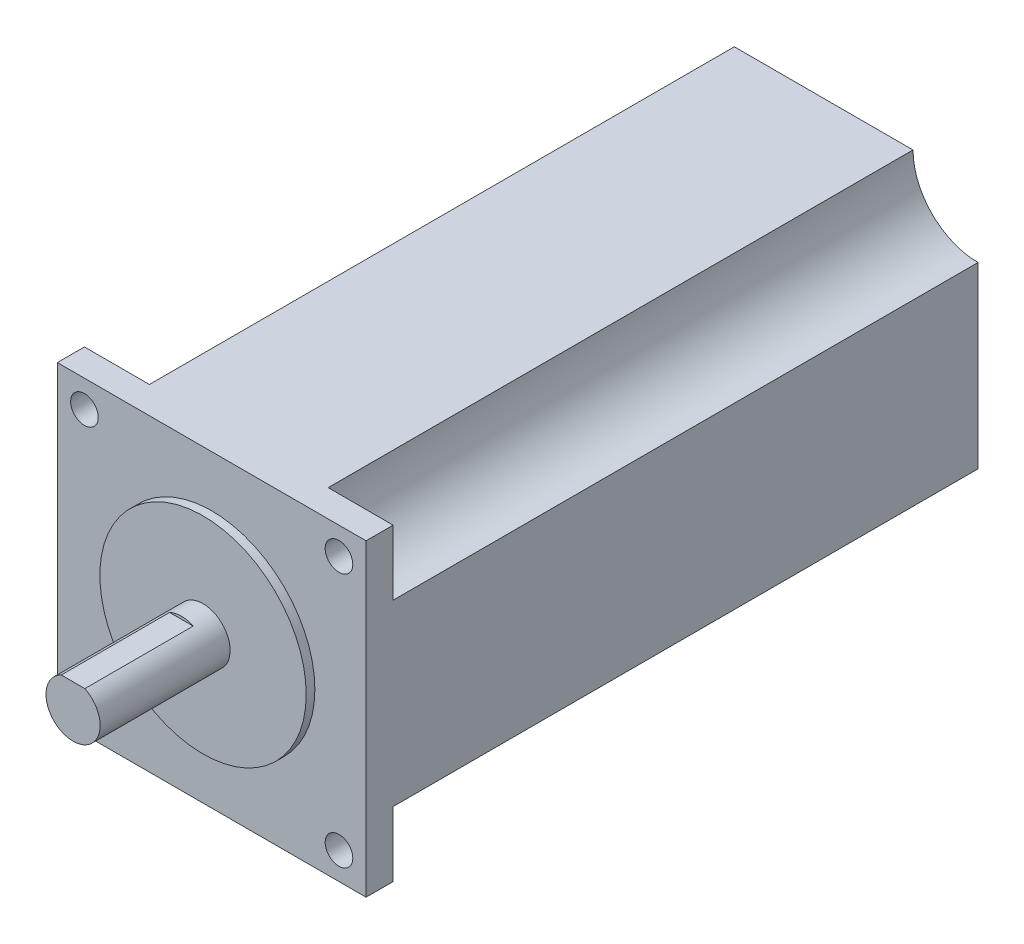
ISO-10303-21;
HEADER;
FILE_DESCRIPTION(('STEP AP214'),'2;1');
FILE_NAME('part.step','',(''),(''),'','','');
FILE_SCHEMA(('AUTOMOTIVE_DESIGN { 1 0 10303 214 1 1 1 1 }'));
ENDSEC;
DATA;
#1=APPLICATION_CONTEXT('core data for automotive mechanical design processes');
#2=APPLICATION_PROTOCOL_DEFINITION('international standard','automotive_design',2000,#1);
#3=PRODUCT_CONTEXT('',#1,'mechanical');
#4=PRODUCT('Part','Part','',(#3));
#5=PRODUCT_RELATED_PRODUCT_CATEGORY('part','',(#4));
#6=PRODUCT_DEFINITION_FORMATION('','',#4);
#7=PRODUCT_DEFINITION_CONTEXT('part definition',#1,'design');
#8=PRODUCT_DEFINITION('design','',#6,#7);
#9=PRODUCT_DEFINITION_SHAPE('','',#8);
#10=(LENGTH_UNIT() NAMED_UNIT(*) SI_UNIT(.MILLI.,.METRE.));
#11=(NAMED_UNIT(*) PLANE_ANGLE_UNIT() SI_UNIT($,.RADIAN.));
#12=(NAMED_UNIT(*) SI_UNIT($,.STERADIAN.) SOLID_ANGLE_UNIT());
#13=UNCERTAINTY_MEASURE_WITH_UNIT(LENGTH_MEASURE(1.E-05),#10,'distance_accuracy_value','');
#14=(GEOMETRIC_REPRESENTATION_CONTEXT(3) GLOBAL_UNCERTAINTY_ASSIGNED_CONTEXT((#13)) GLOBAL_UNIT_ASSIGNED_CONTEXT((#10,
#11,#12)) REPRESENTATION_CONTEXT('',''));
#15=CARTESIAN_POINT('',(0.,0.,0.));
#16=DIRECTION('',(0.,0.,1.));
#17=DIRECTION('',(1.,0.,0.));
#18=AXIS2_PLACEMENT_3D('',#15,#16,#17);
#19=CARTESIAN_POINT('',(0.,0.,0.));
#20=DIRECTION('',(0.,0.,1.));
#21=DIRECTION('',(1.,0.,0.));
#22=AXIS2_PLACEMENT_3D('',#19,#20,#21);
#23=PLANE('',#22);
#24=CARTESIAN_POINT('',(13.1457851813188,-0.458965641473671,0.));
#25=DIRECTION('',(0.,0.,1.));
#26=DIRECTION('',(1.,0.,0.));
#27=AXIS2_PLACEMENT_3D('',#24,#25,#26);
#28=CIRCLE('',#27,2.55);
#29=CARTESIAN_POINT('',(15.6957851813188,-0.458965641473671,0.));
#30=VERTEX_POINT('',#29);
#31=EDGE_CURVE('E230',#30,#30,#28,.T.);
#32=ORIENTED_EDGE('',*,*,#31,.T.);
#33=EDGE_LOOP('',(#32));
#34=FACE_BOUND('',#33,.T.);
#35=CARTESIAN_POINT('',(18.1457851813188,4.54103435852635,0.));
#36=DIRECTION('',(0.,0.,1.));
#37=DIRECTION('',(-1.,0.,0.));
#38=AXIS2_PLACEMENT_3D('',#35,#36,#37);
#39=CIRCLE('',#38,12.);
#40=CARTESIAN_POINT('',(6.14578518131879,4.54103435852635,0.));
#41=VERTEX_POINT('',#40);
#42=CARTESIAN_POINT('',(18.1457851813188,-7.45896564147366,0.));
#43=VERTEX_POINT('',#42);
#44=EDGE_CURVE('E167',#41,#43,#39,.T.);
#45=ORIENTED_EDGE('',*,*,#44,.F.);
#46=DIRECTION('',(-1.,0.,0.));
#47=VECTOR('',#46,1.);
#48=CARTESIAN_POINT('',(-38.8542148186812,4.54103435852635,0.));
#49=LINE('',#48,#47);
#50=CARTESIAN_POINT('',(18.1457851813188,4.54103435852635,0.));
#51=VERTEX_POINT('',#50);
#52=EDGE_CURVE('E249',#51,#41,#49,.T.);
#53=ORIENTED_EDGE('',*,*,#52,.F.);
#54=DIRECTION('',(0.,1.,0.));
#55=VECTOR('',#54,1.);
#56=CARTESIAN_POINT('',(18.1457851813188,4.54103435852635,0.));
#57=LINE('',#56,#55);
#58=EDGE_CURVE('E262',#43,#51,#57,.T.);
#59=ORIENTED_EDGE('',*,*,#58,.F.);
#60=EDGE_LOOP('',(#45,#53,#59));
#61=FACE_BOUND('',#60,.T.);
#62=ADVANCED_FACE('F38',(#34,#61),#23,.F.);
#63=CARTESIAN_POINT('',(-33.8542148186812,-0.458965641473678,0.));
#64=DIRECTION('',(0.,0.,1.));
#65=DIRECTION('',(1.,0.,0.));
#66=AXIS2_PLACEMENT_3D('',#63,#64,#65);
#67=CIRCLE('',#66,2.54999999999999);
#68=CARTESIAN_POINT('',(-31.3042148186812,-0.458965641473678,0.));
#69=VERTEX_POINT('',#68);
#70=EDGE_CURVE('E236',#69,#69,#67,.T.);
#71=ORIENTED_EDGE('',*,*,#70,.T.);
#72=EDGE_LOOP('',(#71));
#73=FACE_BOUND('',#72,.T.);
#74=CARTESIAN_POINT('',(-38.8542148186812,4.54103435852636,0.));
#75=DIRECTION('',(0.,0.,1.));
#76=DIRECTION('',(-1.,0.,0.));
#77=AXIS2_PLACEMENT_3D('',#74,#75,#76);
#78=CIRCLE('',#77,12.);
#79=CARTESIAN_POINT('',(-38.8542148186812,-7.45896564147367,0.));
#80=VERTEX_POINT('',#79);
#81=CARTESIAN_POINT('',(-26.8542148186812,4.54103435852635,0.));
#82=VERTEX_POINT('',#81);
#83=EDGE_CURVE('E174',#80,#82,#78,.T.);
#84=ORIENTED_EDGE('',*,*,#83,.F.);
#85=DIRECTION('',(0.,-1.,0.));
#86=VECTOR('',#85,1.);
#87=CARTESIAN_POINT('',(-38.8542148186812,4.54103435852635,0.));
#88=LINE('',#87,#86);
#89=CARTESIAN_POINT('',(-38.8542148186812,4.54103435852635,0.));
#90=VERTEX_POINT('',#89);
#91=EDGE_CURVE('E256',#90,#80,#88,.T.);
#92=ORIENTED_EDGE('',*,*,#91,.F.);
#93=EDGE_CURVE('E266',#82,#90,#49,.T.);
#94=ORIENTED_EDGE('',*,*,#93,.F.);
#95=EDGE_LOOP('',(#84,#92,#94));
#96=FACE_BOUND('',#95,.T.);
#97=ADVANCED_FACE('F291',(#73,#96),#23,.F.);
#98=CARTESIAN_POINT('',(-33.8542148186812,-47.4589656414737,0.));
#99=DIRECTION('',(0.,0.,1.));
#100=DIRECTION('',(1.,0.,0.));
#101=AXIS2_PLACEMENT_3D('',#98,#99,#100);
#102=CIRCLE('',#101,2.54999999999999);
#103=CARTESIAN_POINT('',(-31.3042148186812,-47.4589656414737,0.));
#104=VERTEX_POINT('',#103);
#105=EDGE_CURVE('E220',#104,#104,#102,.T.);
#106=ORIENTED_EDGE('',*,*,#105,.T.);
#107=EDGE_LOOP('',(#106));
#108=FACE_BOUND('',#107,.T.);
#109=CARTESIAN_POINT('',(-38.8542148186812,-52.4589656414737,0.));
#110=DIRECTION('',(0.,0.,1.));
#111=DIRECTION('',(1.,0.,0.));
#112=AXIS2_PLACEMENT_3D('',#109,#110,#111);
#113=CIRCLE('',#112,12.);
#114=CARTESIAN_POINT('',(-26.8542148186812,-52.4589656414737,0.));
#115=VERTEX_POINT('',#114);
#116=CARTESIAN_POINT('',(-38.8542148186812,-40.4589656414736,0.));
#117=VERTEX_POINT('',#116);
#118=EDGE_CURVE('E61',#115,#117,#113,.T.);
#119=ORIENTED_EDGE('',*,*,#118,.F.);
#120=DIRECTION('',(1.,0.,0.));
#121=VECTOR('',#120,1.);
#122=CARTESIAN_POINT('',(-38.8542148186812,-52.4589656414737,0.));
#123=LINE('',#122,#121);
#124=CARTESIAN_POINT('',(-38.8542148186812,-52.4589656414737,0.));
#125=VERTEX_POINT('',#124);
#126=EDGE_CURVE('E260',#125,#115,#123,.T.);
#127=ORIENTED_EDGE('',*,*,#126,.F.);
#128=EDGE_CURVE('E242',#117,#125,#88,.T.);
#129=ORIENTED_EDGE('',*,*,#128,.F.);
#130=EDGE_LOOP('',(#119,#127,#129));
#131=FACE_BOUND('',#130,.T.);
#132=ADVANCED_FACE('F288',(#108,#131),#23,.F.);
#133=CARTESIAN_POINT('',(13.1457851813188,-47.4589656414737,0.));
#134=DIRECTION('',(0.,0.,1.));
#135=DIRECTION('',(1.,0.,0.));
#136=AXIS2_PLACEMENT_3D('',#133,#134,#135);
#137=CIRCLE('',#136,2.55);
#138=CARTESIAN_POINT('',(15.6957851813188,-47.4589656414737,0.));
#139=VERTEX_POINT('',#138);
#140=EDGE_CURVE('E224',#139,#139,#137,.T.);
#141=ORIENTED_EDGE('',*,*,#140,.T.);
#142=EDGE_LOOP('',(#141));
#143=FACE_BOUND('',#142,.T.);
#144=CARTESIAN_POINT('',(18.1457851813188,-52.4589656414737,0.));
#145=DIRECTION('',(0.,0.,1.));
#146=DIRECTION('',(-1.,0.,0.));
#147=AXIS2_PLACEMENT_3D('',#144,#145,#146);
#148=CIRCLE('',#147,12.);
#149=CARTESIAN_POINT('',(18.1457851813188,-40.4589656414737,0.));
#150=VERTEX_POINT('',#149);
#151=CARTESIAN_POINT('',(6.14578518131879,-52.4589656414737,0.));
#152=VERTEX_POINT('',#151);
#153=EDGE_CURVE('E191',#150,#152,#148,.T.);
#154=ORIENTED_EDGE('',*,*,#153,.F.);
#155=CARTESIAN_POINT('',(18.1457851813188,-52.4589656414737,0.));
#156=VERTEX_POINT('',#155);
#157=EDGE_CURVE('E263',#156,#150,#57,.T.);
#158=ORIENTED_EDGE('',*,*,#157,.F.);
#159=EDGE_CURVE('E259',#152,#156,#123,.T.);
#160=ORIENTED_EDGE('',*,*,#159,.F.);
#161=EDGE_LOOP('',(#154,#158,#160));
#162=FACE_BOUND('',#161,.T.);
#163=ADVANCED_FACE('F290',(#143,#162),#23,.F.);
#164=CARTESIAN_POINT('',(0.,0.,5.));
#165=DIRECTION('',(0.,0.,1.));
#166=DIRECTION('',(1.,0.,0.));
#167=AXIS2_PLACEMENT_3D('',#164,#165,#166);
#168=PLANE('',#167);
#169=CARTESIAN_POINT('',(-10.3542148186812,-23.9589656414737,5.));
#170=DIRECTION('',(0.,0.,1.));
#171=DIRECTION('',(1.,0.,0.));
#172=AXIS2_PLACEMENT_3D('',#169,#170,#171);
#173=CIRCLE('',#172,19.05);
#174=CARTESIAN_POINT('',(8.6957851813188,-23.9589656414737,5.));
#175=VERTEX_POINT('',#174);
#176=EDGE_CURVE('E159',#175,#175,#173,.T.);
#177=ORIENTED_EDGE('',*,*,#176,.F.);
#178=EDGE_LOOP('',(#177));
#179=FACE_BOUND('',#178,.T.);
#180=CARTESIAN_POINT('',(13.1457851813188,-47.4589656414737,5.));
#181=DIRECTION('',(0.,0.,1.));
#182=DIRECTION('',(1.,0.,0.));
#183=AXIS2_PLACEMENT_3D('',#180,#181,#182);
#184=CIRCLE('',#183,2.55);
#185=CARTESIAN_POINT('',(15.6957851813188,-47.4589656414737,5.));
#186=VERTEX_POINT('',#185);
#187=EDGE_CURVE('E227',#186,#186,#184,.T.);
#188=ORIENTED_EDGE('',*,*,#187,.F.);
#189=EDGE_LOOP('',(#188));
#190=FACE_BOUND('',#189,.T.);
#191=CARTESIAN_POINT('',(-33.8542148186812,-0.458965641473678,5.));
#192=DIRECTION('',(0.,0.,1.));
#193=DIRECTION('',(1.,0.,0.));
#194=AXIS2_PLACEMENT_3D('',#191,#192,#193);
#195=CIRCLE('',#194,2.54999999999999);
#196=CARTESIAN_POINT('',(-31.3042148186812,-0.458965641473678,5.));
#197=VERTEX_POINT('',#196);
#198=EDGE_CURVE('E239',#197,#197,#195,.T.);
#199=ORIENTED_EDGE('',*,*,#198,.F.);
#200=EDGE_LOOP('',(#199));
#201=FACE_BOUND('',#200,.T.);
#202=DIRECTION('',(0.,-1.,0.));
#203=VECTOR('',#202,1.);
#204=CARTESIAN_POINT('',(-38.8542148186812,4.54103435852635,5.));
#205=LINE('',#204,#203);
#206=CARTESIAN_POINT('',(-38.8542148186812,4.54103435852635,5.));
#207=VERTEX_POINT('',#206);
#208=CARTESIAN_POINT('',(-38.8542148186812,-52.4589656414737,5.));
#209=VERTEX_POINT('',#208);
#210=EDGE_CURVE('E245',#207,#209,#205,.T.);
#211=ORIENTED_EDGE('',*,*,#210,.T.);
#212=DIRECTION('',(1.,0.,0.));
#213=VECTOR('',#212,1.);
#214=CARTESIAN_POINT('',(-38.8542148186812,-52.4589656414737,5.));
#215=LINE('',#214,#213);
#216=CARTESIAN_POINT('',(18.1457851813188,-52.4589656414737,5.));
#217=VERTEX_POINT('',#216);
#218=EDGE_CURVE('E248',#209,#217,#215,.T.);
#219=ORIENTED_EDGE('',*,*,#218,.T.);
#220=DIRECTION('',(0.,1.,0.));
#221=VECTOR('',#220,1.);
#222=CARTESIAN_POINT('',(18.1457851813188,4.54103435852635,5.));
#223=LINE('',#222,#221);
#224=CARTESIAN_POINT('',(18.1457851813188,4.54103435852635,5.));
#225=VERTEX_POINT('',#224);
#226=EDGE_CURVE('E251',#217,#225,#223,.T.);
#227=ORIENTED_EDGE('',*,*,#226,.T.);
#228=DIRECTION('',(-1.,0.,0.));
#229=VECTOR('',#228,1.);
#230=CARTESIAN_POINT('',(-38.8542148186812,4.54103435852635,5.));
#231=LINE('',#230,#229);
#232=EDGE_CURVE('E253',#225,#207,#231,.T.);
#233=ORIENTED_EDGE('',*,*,#232,.T.);
#234=EDGE_LOOP('',(#211,#219,#227,#233));
#235=FACE_BOUND('',#234,.T.);
#236=CARTESIAN_POINT('',(13.1457851813188,-0.458965641473671,5.));
#237=DIRECTION('',(0.,0.,1.));
#238=DIRECTION('',(1.,0.,0.));
#239=AXIS2_PLACEMENT_3D('',#236,#237,#238);
#240=CIRCLE('',#239,2.55);
#241=CARTESIAN_POINT('',(15.6957851813188,-0.458965641473671,5.));
#242=VERTEX_POINT('',#241);
#243=EDGE_CURVE('E233',#242,#242,#240,.T.);
#244=ORIENTED_EDGE('',*,*,#243,.F.);
#245=EDGE_LOOP('',(#244));
#246=FACE_BOUND('',#245,.T.);
#247=CARTESIAN_POINT('',(-33.8542148186812,-47.4589656414737,5.));
#248=DIRECTION('',(0.,0.,1.));
#249=DIRECTION('',(1.,0.,0.));
#250=AXIS2_PLACEMENT_3D('',#247,#248,#249);
#251=CIRCLE('',#250,2.54999999999999);
#252=CARTESIAN_POINT('',(-31.3042148186812,-47.4589656414737,5.));
#253=VERTEX_POINT('',#252);
#254=EDGE_CURVE('E221',#253,#253,#251,.T.);
#255=ORIENTED_EDGE('',*,*,#254,.F.);
#256=EDGE_LOOP('',(#255));
#257=FACE_BOUND('',#256,.T.);
#258=ADVANCED_FACE('F298',(#179,#190,#201,#235,#246,#257),#168,.T.);
#259=CARTESIAN_POINT('',(-38.8542148186812,4.54103435852635,5.));
#260=DIRECTION('',(1.,0.,0.));
#261=DIRECTION('',(0.,0.,-1.));
#262=AXIS2_PLACEMENT_3D('',#259,#260,#261);
#263=PLANE('',#262);
#264=ORIENTED_EDGE('',*,*,#91,.T.);
#265=DIRECTION('',(0.,0.,1.));
#266=VECTOR('',#265,1.);
#267=CARTESIAN_POINT('',(-38.8542148186812,-7.45896564147367,-108.));
#268=LINE('',#267,#266);
#269=CARTESIAN_POINT('',(-38.8542148186812,-7.45896564147367,-108.));
#270=VERTEX_POINT('',#269);
#271=EDGE_CURVE('E202',#270,#80,#268,.T.);
#272=ORIENTED_EDGE('',*,*,#271,.F.);
#273=DIRECTION('',(0.,1.,0.));
#274=VECTOR('',#273,1.);
#275=CARTESIAN_POINT('',(-38.8542148186812,-7.45896564147366,-108.));
#276=LINE('',#275,#274);
#277=CARTESIAN_POINT('',(-38.8542148186812,-40.4589656414737,-108.));
#278=VERTEX_POINT('',#277);
#279=EDGE_CURVE('E182',#278,#270,#276,.T.);
#280=ORIENTED_EDGE('',*,*,#279,.F.);
#281=DIRECTION('',(0.,0.,1.));
#282=VECTOR('',#281,1.);
#283=CARTESIAN_POINT('',(-38.8542148186812,-40.4589656414737,-108.));
#284=LINE('',#283,#282);
#285=EDGE_CURVE('E205',#278,#117,#284,.T.);
#286=ORIENTED_EDGE('',*,*,#285,.T.);
#287=ORIENTED_EDGE('',*,*,#128,.T.);
#288=DIRECTION('',(0.,0.,-1.));
#289=VECTOR('',#288,1.);
#290=CARTESIAN_POINT('',(-38.8542148186812,-52.4589656414737,5.));
#291=LINE('',#290,#289);
#292=EDGE_CURVE('E42',#209,#125,#291,.T.);
#293=ORIENTED_EDGE('',*,*,#292,.F.);
#294=ORIENTED_EDGE('',*,*,#210,.F.);
#295=DIRECTION('',(0.,0.,-1.));
#296=VECTOR('',#295,1.);
#297=CARTESIAN_POINT('',(-38.8542148186812,4.54103435852635,5.));
#298=LINE('',#297,#296);
#299=EDGE_CURVE('E255',#207,#90,#298,.T.);
#300=ORIENTED_EDGE('',*,*,#299,.T.);
#301=EDGE_LOOP('',(#264,#272,#280,#286,#287,#293,#294,#300));
#302=FACE_BOUND('',#301,.T.);
#303=ADVANCED_FACE('F40',(#302),#263,.F.);
#304=CARTESIAN_POINT('',(-38.8542148186812,-52.4589656414737,5.));
#305=DIRECTION('',(0.,1.,0.));
#306=DIRECTION('',(0.,0.,1.));
#307=AXIS2_PLACEMENT_3D('',#304,#305,#306);
#308=PLANE('',#307);
#309=ORIENTED_EDGE('',*,*,#126,.T.);
#310=DIRECTION('',(0.,0.,1.));
#311=VECTOR('',#310,1.);
#312=CARTESIAN_POINT('',(-26.8542148186812,-52.4589656414737,-108.));
#313=LINE('',#312,#311);
#314=CARTESIAN_POINT('',(-26.8542148186812,-52.4589656414737,-108.));
#315=VERTEX_POINT('',#314);
#316=EDGE_CURVE('E208',#315,#115,#313,.T.);
#317=ORIENTED_EDGE('',*,*,#316,.F.);
#318=DIRECTION('',(-1.,0.,0.));
#319=VECTOR('',#318,1.);
#320=CARTESIAN_POINT('',(6.14578518131879,-52.4589656414737,-108.));
#321=LINE('',#320,#319);
#322=CARTESIAN_POINT('',(6.14578518131879,-52.4589656414737,-108.));
#323=VERTEX_POINT('',#322);
#324=EDGE_CURVE('E178',#323,#315,#321,.T.);
#325=ORIENTED_EDGE('',*,*,#324,.F.);
#326=DIRECTION('',(0.,0.,1.));
#327=VECTOR('',#326,1.);
#328=CARTESIAN_POINT('',(6.14578518131879,-52.4589656414737,-108.));
#329=LINE('',#328,#327);
#330=EDGE_CURVE('E211',#323,#152,#329,.T.);
#331=ORIENTED_EDGE('',*,*,#330,.T.);
#332=ORIENTED_EDGE('',*,*,#159,.T.);
#333=DIRECTION('',(0.,0.,-1.));
#334=VECTOR('',#333,1.);
#335=CARTESIAN_POINT('',(18.1457851813188,-52.4589656414737,5.));
#336=LINE('',#335,#334);
#337=EDGE_CURVE('E273',#217,#156,#336,.T.);
#338=ORIENTED_EDGE('',*,*,#337,.F.);
#339=ORIENTED_EDGE('',*,*,#218,.F.);
#340=ORIENTED_EDGE('',*,*,#292,.T.);
#341=EDGE_LOOP('',(#309,#317,#325,#331,#332,#338,#339,#340));
#342=FACE_BOUND('',#341,.T.);
#343=ADVANCED_FACE('F282',(#342),#308,.F.);
#344=CARTESIAN_POINT('',(18.1457851813188,4.54103435852635,5.));
#345=DIRECTION('',(-1.,0.,0.));
#346=DIRECTION('',(0.,0.,1.));
#347=AXIS2_PLACEMENT_3D('',#344,#345,#346);
#348=PLANE('',#347);
#349=ORIENTED_EDGE('',*,*,#157,.T.);
#350=DIRECTION('',(0.,0.,1.));
#351=VECTOR('',#350,1.);
#352=CARTESIAN_POINT('',(18.1457851813188,-40.4589656414737,-108.));
#353=LINE('',#352,#351);
#354=CARTESIAN_POINT('',(18.1457851813188,-40.4589656414737,-108.));
#355=VERTEX_POINT('',#354);
#356=EDGE_CURVE('E214',#355,#150,#353,.T.);
#357=ORIENTED_EDGE('',*,*,#356,.F.);
#358=DIRECTION('',(0.,-1.,0.));
#359=VECTOR('',#358,1.);
#360=CARTESIAN_POINT('',(18.1457851813188,-7.45896564147366,-108.));
#361=LINE('',#360,#359);
#362=CARTESIAN_POINT('',(18.1457851813188,-7.45896564147366,-108.));
#363=VERTEX_POINT('',#362);
#364=EDGE_CURVE('E173',#363,#355,#361,.T.);
#365=ORIENTED_EDGE('',*,*,#364,.F.);
#366=DIRECTION('',(0.,0.,1.));
#367=VECTOR('',#366,1.);
#368=CARTESIAN_POINT('',(18.1457851813188,-7.45896564147366,-108.));
#369=LINE('',#368,#367);
#370=EDGE_CURVE('E217',#363,#43,#369,.T.);
#371=ORIENTED_EDGE('',*,*,#370,.T.);
#372=ORIENTED_EDGE('',*,*,#58,.T.);
#373=DIRECTION('',(0.,0.,-1.));
#374=VECTOR('',#373,1.);
#375=CARTESIAN_POINT('',(18.1457851813188,4.54103435852635,5.));
#376=LINE('',#375,#374);
#377=EDGE_CURVE('E271',#225,#51,#376,.T.);
#378=ORIENTED_EDGE('',*,*,#377,.F.);
#379=ORIENTED_EDGE('',*,*,#226,.F.);
#380=ORIENTED_EDGE('',*,*,#337,.T.);
#381=EDGE_LOOP('',(#349,#357,#365,#371,#372,#378,#379,#380));
#382=FACE_BOUND('',#381,.T.);
#383=ADVANCED_FACE('F333',(#382),#348,.F.);
#384=CARTESIAN_POINT('',(-38.8542148186812,4.54103435852635,5.));
#385=DIRECTION('',(0.,-1.,0.));
#386=DIRECTION('',(0.,0.,-1.));
#387=AXIS2_PLACEMENT_3D('',#384,#385,#386);
#388=PLANE('',#387);
#389=ORIENTED_EDGE('',*,*,#52,.T.);
#390=DIRECTION('',(0.,0.,1.));
#391=VECTOR('',#390,1.);
#392=CARTESIAN_POINT('',(6.14578518131879,4.54103435852635,-108.));
#393=LINE('',#392,#391);
#394=CARTESIAN_POINT('',(6.14578518131879,4.54103435852635,-108.));
#395=VERTEX_POINT('',#394);
#396=EDGE_CURVE('E188',#395,#41,#393,.T.);
#397=ORIENTED_EDGE('',*,*,#396,.F.);
#398=DIRECTION('',(1.,0.,0.));
#399=VECTOR('',#398,1.);
#400=CARTESIAN_POINT('',(6.14578518131879,4.54103435852635,-108.));
#401=LINE('',#400,#399);
#402=CARTESIAN_POINT('',(-26.8542148186812,4.54103435852636,-108.));
#403=VERTEX_POINT('',#402);
#404=EDGE_CURVE('E186',#403,#395,#401,.T.);
#405=ORIENTED_EDGE('',*,*,#404,.F.);
#406=DIRECTION('',(0.,0.,1.));
#407=VECTOR('',#406,1.);
#408=CARTESIAN_POINT('',(-26.8542148186812,4.54103435852636,-108.));
#409=LINE('',#408,#407);
#410=EDGE_CURVE('E199',#403,#82,#409,.T.);
#411=ORIENTED_EDGE('',*,*,#410,.T.);
#412=ORIENTED_EDGE('',*,*,#93,.T.);
#413=ORIENTED_EDGE('',*,*,#299,.F.);
#414=ORIENTED_EDGE('',*,*,#232,.F.);
#415=ORIENTED_EDGE('',*,*,#377,.T.);
#416=EDGE_LOOP('',(#389,#397,#405,#411,#412,#413,#414,#415));
#417=FACE_BOUND('',#416,.T.);
#418=ADVANCED_FACE('F314',(#417),#388,.F.);
#419=CARTESIAN_POINT('',(-33.8542148186812,-0.458965641473678,5.));
#420=DIRECTION('',(0.,0.,-1.));
#421=DIRECTION('',(-1.,0.,0.));
#422=AXIS2_PLACEMENT_3D('',#419,#420,#421);
#423=CYLINDRICAL_SURFACE('',#422,2.54999999999999);
#424=ORIENTED_EDGE('',*,*,#198,.T.);
#425=EDGE_LOOP('',(#424));
#426=FACE_BOUND('',#425,.T.);
#427=ORIENTED_EDGE('',*,*,#70,.F.);
#428=EDGE_LOOP('',(#427));
#429=FACE_BOUND('',#428,.T.);
#430=ADVANCED_FACE('F365',(#426,#429),#423,.F.);
#431=CARTESIAN_POINT('',(13.1457851813188,-0.458965641473671,5.));
#432=DIRECTION('',(0.,0.,-1.));
#433=DIRECTION('',(-1.,0.,0.));
#434=AXIS2_PLACEMENT_3D('',#431,#432,#433);
#435=CYLINDRICAL_SURFACE('',#434,2.55);
#436=ORIENTED_EDGE('',*,*,#243,.T.);
#437=EDGE_LOOP('',(#436));
#438=FACE_BOUND('',#437,.T.);
#439=ORIENTED_EDGE('',*,*,#31,.F.);
#440=EDGE_LOOP('',(#439));
#441=FACE_BOUND('',#440,.T.);
#442=ADVANCED_FACE('F361',(#438,#441),#435,.F.);
#443=CARTESIAN_POINT('',(13.1457851813188,-47.4589656414737,5.));
#444=DIRECTION('',(0.,0.,-1.));
#445=DIRECTION('',(-1.,0.,0.));
#446=AXIS2_PLACEMENT_3D('',#443,#444,#445);
#447=CYLINDRICAL_SURFACE('',#446,2.55);
#448=ORIENTED_EDGE('',*,*,#187,.T.);
#449=EDGE_LOOP('',(#448));
#450=FACE_BOUND('',#449,.T.);
#451=ORIENTED_EDGE('',*,*,#140,.F.);
#452=EDGE_LOOP('',(#451));
#453=FACE_BOUND('',#452,.T.);
#454=ADVANCED_FACE('F357',(#450,#453),#447,.F.);
#455=CARTESIAN_POINT('',(-33.8542148186812,-47.4589656414737,5.));
#456=DIRECTION('',(0.,0.,-1.));
#457=DIRECTION('',(-1.,0.,0.));
#458=AXIS2_PLACEMENT_3D('',#455,#456,#457);
#459=CYLINDRICAL_SURFACE('',#458,2.54999999999999);
#460=ORIENTED_EDGE('',*,*,#254,.T.);
#461=EDGE_LOOP('',(#460));
#462=FACE_BOUND('',#461,.T.);
#463=ORIENTED_EDGE('',*,*,#105,.F.);
#464=EDGE_LOOP('',(#463));
#465=FACE_BOUND('',#464,.T.);
#466=ADVANCED_FACE('F354',(#462,#465),#459,.F.);
#467=CARTESIAN_POINT('',(18.1457851813188,4.54103435852635,-108.));
#468=DIRECTION('',(0.,0.,1.));
#469=DIRECTION('',(1.,0.,0.));
#470=AXIS2_PLACEMENT_3D('',#467,#468,#469);
#471=CYLINDRICAL_SURFACE('',#470,12.);
#472=ORIENTED_EDGE('',*,*,#44,.T.);
#473=ORIENTED_EDGE('',*,*,#370,.F.);
#474=CARTESIAN_POINT('',(18.1457851813188,4.54103435852635,-108.));
#475=DIRECTION('',(0.,0.,1.));
#476=DIRECTION('',(-1.,0.,0.));
#477=AXIS2_PLACEMENT_3D('',#474,#475,#476);
#478=CIRCLE('',#477,12.);
#479=EDGE_CURVE('E170',#395,#363,#478,.T.);
#480=ORIENTED_EDGE('',*,*,#479,.F.);
#481=ORIENTED_EDGE('',*,*,#396,.T.);
#482=EDGE_LOOP('',(#472,#473,#480,#481));
#483=FACE_BOUND('',#482,.T.);
#484=ADVANCED_FACE('F319',(#483),#471,.F.);
#485=CARTESIAN_POINT('',(18.1457851813188,-52.4589656414737,-108.));
#486=DIRECTION('',(0.,0.,1.));
#487=DIRECTION('',(1.,0.,0.));
#488=AXIS2_PLACEMENT_3D('',#485,#486,#487);
#489=CYLINDRICAL_SURFACE('',#488,12.);
#490=ORIENTED_EDGE('',*,*,#153,.T.);
#491=ORIENTED_EDGE('',*,*,#330,.F.);
#492=CARTESIAN_POINT('',(18.1457851813188,-52.4589656414737,-108.));
#493=DIRECTION('',(0.,0.,1.));
#494=DIRECTION('',(-1.,0.,0.));
#495=AXIS2_PLACEMENT_3D('',#492,#493,#494);
#496=CIRCLE('',#495,12.);
#497=EDGE_CURVE('E176',#355,#323,#496,.T.);
#498=ORIENTED_EDGE('',*,*,#497,.F.);
#499=ORIENTED_EDGE('',*,*,#356,.T.);
#500=EDGE_LOOP('',(#490,#491,#498,#499));
#501=FACE_BOUND('',#500,.T.);
#502=ADVANCED_FACE('F337',(#501),#489,.F.);
#503=CARTESIAN_POINT('',(-38.8542148186812,-52.4589656414737,-108.));
#504=DIRECTION('',(0.,0.,1.));
#505=DIRECTION('',(1.,0.,0.));
#506=AXIS2_PLACEMENT_3D('',#503,#504,#505);
#507=CYLINDRICAL_SURFACE('',#506,12.);
#508=ORIENTED_EDGE('',*,*,#118,.T.);
#509=ORIENTED_EDGE('',*,*,#285,.F.);
#510=CARTESIAN_POINT('',(-38.8542148186812,-52.4589656414737,-108.));
#511=DIRECTION('',(0.,0.,1.));
#512=DIRECTION('',(1.,0.,0.));
#513=AXIS2_PLACEMENT_3D('',#510,#511,#512);
#514=CIRCLE('',#513,12.);
#515=EDGE_CURVE('E180',#315,#278,#514,.T.);
#516=ORIENTED_EDGE('',*,*,#515,.F.);
#517=ORIENTED_EDGE('',*,*,#316,.T.);
#518=EDGE_LOOP('',(#508,#509,#516,#517));
#519=FACE_BOUND('',#518,.T.);
#520=ADVANCED_FACE('F341',(#519),#507,.F.);
#521=CARTESIAN_POINT('',(-38.8542148186812,4.54103435852636,-108.));
#522=DIRECTION('',(0.,0.,1.));
#523=DIRECTION('',(1.,0.,0.));
#524=AXIS2_PLACEMENT_3D('',#521,#522,#523);
#525=CYLINDRICAL_SURFACE('',#524,12.);
#526=ORIENTED_EDGE('',*,*,#83,.T.);
#527=ORIENTED_EDGE('',*,*,#410,.F.);
#528=CARTESIAN_POINT('',(-38.8542148186812,4.54103435852636,-108.));
#529=DIRECTION('',(0.,0.,1.));
#530=DIRECTION('',(-1.,0.,0.));
#531=AXIS2_PLACEMENT_3D('',#528,#529,#530);
#532=CIRCLE('',#531,12.);
#533=EDGE_CURVE('E184',#270,#403,#532,.T.);
#534=ORIENTED_EDGE('',*,*,#533,.F.);
#535=ORIENTED_EDGE('',*,*,#271,.T.);
#536=EDGE_LOOP('',(#526,#527,#534,#535));
#537=FACE_BOUND('',#536,.T.);
#538=ADVANCED_FACE('F327',(#537),#525,.F.);
#539=CARTESIAN_POINT('',(18.1457851813188,4.54103435852635,-108.));
#540=DIRECTION('',(0.,0.,-1.));
#541=DIRECTION('',(-1.,0.,0.));
#542=AXIS2_PLACEMENT_3D('',#539,#540,#541);
#543=PLANE('',#542);
#544=ORIENTED_EDGE('',*,*,#479,.T.);
#545=ORIENTED_EDGE('',*,*,#364,.T.);
#546=ORIENTED_EDGE('',*,*,#497,.T.);
#547=ORIENTED_EDGE('',*,*,#324,.T.);
#548=ORIENTED_EDGE('',*,*,#515,.T.);
#549=ORIENTED_EDGE('',*,*,#279,.T.);
#550=ORIENTED_EDGE('',*,*,#533,.T.);
#551=ORIENTED_EDGE('',*,*,#404,.T.);
#552=EDGE_LOOP('',(#544,#545,#546,#547,#548,#549,#550,#551));
#553=FACE_BOUND('',#552,.T.);
#554=ADVANCED_FACE('F321',(#553),#543,.T.);
#555=CARTESIAN_POINT('',(-10.3542148186812,-23.9589656414737,6.6));
#556=DIRECTION('',(0.,0.,-1.));
#557=DIRECTION('',(-1.,0.,0.));
#558=AXIS2_PLACEMENT_3D('',#555,#556,#557);
#559=CYLINDRICAL_SURFACE('',#558,19.05);
#560=CARTESIAN_POINT('',(-10.3542148186812,-23.9589656414737,6.6));
#561=DIRECTION('',(0.,0.,1.));
#562=DIRECTION('',(1.,0.,0.));
#563=AXIS2_PLACEMENT_3D('',#560,#561,#562);
#564=CIRCLE('',#563,19.05);
#565=CARTESIAN_POINT('',(8.6957851813188,-23.9589656414737,6.6));
#566=VERTEX_POINT('',#565);
#567=EDGE_CURVE('E164',#566,#566,#564,.T.);
#568=ORIENTED_EDGE('',*,*,#567,.F.);
#569=EDGE_LOOP('',(#568));
#570=FACE_BOUND('',#569,.T.);
#571=ORIENTED_EDGE('',*,*,#176,.T.);
#572=EDGE_LOOP('',(#571));
#573=FACE_BOUND('',#572,.T.);
#574=ADVANCED_FACE('F385',(#570,#573),#559,.T.);
#575=CARTESIAN_POINT('',(-10.3542148186812,-23.9589656414737,6.6));
#576=DIRECTION('',(0.,0.,1.));
#577=DIRECTION('',(1.,0.,0.));
#578=AXIS2_PLACEMENT_3D('',#575,#576,#577);
#579=PLANE('',#578);
#580=CARTESIAN_POINT('',(-10.3542148186812,-23.9589656414737,6.6));
#581=DIRECTION('',(0.,0.,1.));
#582=DIRECTION('',(1.,0.,0.));
#583=AXIS2_PLACEMENT_3D('',#580,#581,#582);
#584=CIRCLE('',#583,5.);
#585=CARTESIAN_POINT('',(-5.3542148186812,-23.9589656414737,6.6));
#586=VERTEX_POINT('',#585);
#587=EDGE_CURVE('E11',#586,#586,#584,.T.);
#588=ORIENTED_EDGE('',*,*,#587,.F.);
#589=EDGE_LOOP('',(#588));
#590=FACE_BOUND('',#589,.T.);
#591=ORIENTED_EDGE('',*,*,#567,.T.);
#592=EDGE_LOOP('',(#591));
#593=FACE_BOUND('',#592,.T.);
#594=ADVANCED_FACE('F387',(#590,#593),#579,.T.);
#595=CARTESIAN_POINT('',(-10.3542148186812,-23.9589656414737,10.6));
#596=DIRECTION('',(0.,0.,-1.));
#597=DIRECTION('',(-1.,0.,0.));
#598=AXIS2_PLACEMENT_3D('',#595,#596,#597);
#599=CYLINDRICAL_SURFACE('',#598,5.);
#600=CARTESIAN_POINT('',(-10.3542148186812,-23.9589656414737,10.6));
#601=DIRECTION('',(0.,0.,1.));
#602=DIRECTION('',(1.,0.,0.));
#603=AXIS2_PLACEMENT_3D('',#600,#601,#602);
#604=CIRCLE('',#603,5.);
#605=CARTESIAN_POINT('',(-8.17476534691086,-19.4589656414737,10.6));
#606=VERTEX_POINT('',#605);
#607=CARTESIAN_POINT('',(-12.5336642904516,-19.4589656414737,10.6));
#608=VERTEX_POINT('',#607);
#609=EDGE_CURVE('E157',#606,#608,#604,.T.);
#610=ORIENTED_EDGE('',*,*,#609,.F.);
#611=DIRECTION('',(0.,0.,-1.));
#612=VECTOR('',#611,1.);
#613=CARTESIAN_POINT('',(-8.17476534691086,-19.4589656414737,30.6));
#614=LINE('',#613,#612);
#615=CARTESIAN_POINT('',(-8.17476534691086,-19.4589656414737,30.6));
#616=VERTEX_POINT('',#615);
#617=EDGE_CURVE('E145',#616,#606,#614,.T.);
#618=ORIENTED_EDGE('',*,*,#617,.F.);
#619=CARTESIAN_POINT('',(-10.3542148186812,-23.9589656414737,30.6));
#620=DIRECTION('',(0.,0.,1.));
#621=DIRECTION('',(-1.,0.,0.));
#622=AXIS2_PLACEMENT_3D('',#619,#620,#621);
#623=CIRCLE('',#622,5.);
#624=CARTESIAN_POINT('',(-12.5336642904516,-19.4589656414737,30.6));
#625=VERTEX_POINT('',#624);
#626=EDGE_CURVE('E150',#625,#616,#623,.T.);
#627=ORIENTED_EDGE('',*,*,#626,.F.);
#628=DIRECTION('',(0.,0.,-1.));
#629=VECTOR('',#628,1.);
#630=CARTESIAN_POINT('',(-12.5336642904516,-19.4589656414737,30.6));
#631=LINE('',#630,#629);
#632=EDGE_CURVE('E147',#625,#608,#631,.T.);
#633=ORIENTED_EDGE('',*,*,#632,.T.);
#634=EDGE_LOOP('',(#610,#618,#627,#633));
#635=FACE_BOUND('',#634,.T.);
#636=ORIENTED_EDGE('',*,*,#587,.T.);
#637=EDGE_LOOP('',(#636));
#638=FACE_BOUND('',#637,.T.);
#639=ADVANCED_FACE('F155',(#635,#638),#599,.T.);
#640=CARTESIAN_POINT('',(-10.3542148186812,-23.9589656414737,10.6));
#641=DIRECTION('',(0.,0.,1.));
#642=DIRECTION('',(1.,0.,0.));
#643=AXIS2_PLACEMENT_3D('',#640,#641,#642);
#644=PLANE('',#643);
#645=DIRECTION('',(-1.,0.,0.));
#646=VECTOR('',#645,1.);
#647=CARTESIAN_POINT('',(-12.5336642904516,-19.4589656414737,10.6));
#648=LINE('',#647,#646);
#649=EDGE_CURVE('E53',#606,#608,#648,.T.);
#650=ORIENTED_EDGE('',*,*,#649,.F.);
#651=ORIENTED_EDGE('',*,*,#609,.T.);
#652=EDGE_LOOP('',(#650,#651));
#653=FACE_BOUND('',#652,.T.);
#654=ADVANCED_FACE('F400',(#653),#644,.T.);
#655=CARTESIAN_POINT('',(-12.5336642904516,-19.4589656414737,30.6));
#656=DIRECTION('',(0.,-1.,0.));
#657=DIRECTION('',(0.,0.,-1.));
#658=AXIS2_PLACEMENT_3D('',#655,#656,#657);
#659=PLANE('',#658);
#660=ORIENTED_EDGE('',*,*,#649,.T.);
#661=ORIENTED_EDGE('',*,*,#632,.F.);
#662=DIRECTION('',(-1.,0.,0.));
#663=VECTOR('',#662,1.);
#664=CARTESIAN_POINT('',(-12.5336642904516,-19.4589656414737,30.6));
#665=LINE('',#664,#663);
#666=EDGE_CURVE('E141',#616,#625,#665,.T.);
#667=ORIENTED_EDGE('',*,*,#666,.F.);
#668=ORIENTED_EDGE('',*,*,#617,.T.);
#669=EDGE_LOOP('',(#660,#661,#667,#668));
#670=FACE_BOUND('',#669,.T.);
#671=ADVANCED_FACE('F143',(#670),#659,.F.);
#672=CARTESIAN_POINT('',(-10.3542148186812,-23.9589656414737,30.6));
#673=DIRECTION('',(0.,0.,-1.));
#674=DIRECTION('',(-1.,0.,0.));
#675=AXIS2_PLACEMENT_3D('',#672,#673,#674);
#676=PLANE('',#675);
#677=ORIENTED_EDGE('',*,*,#626,.T.);
#678=ORIENTED_EDGE('',*,*,#666,.T.);
#679=EDGE_LOOP('',(#677,#678));
#680=FACE_BOUND('',#679,.T.);
#681=ADVANCED_FACE('F152',(#680),#676,.F.);
#682=CLOSED_SHELL('',(#62,#97,#132,#163,#258,#303,#343,#383,#418,#430,#442,#454,#466,#484,#502,
#520,#538,#554,#574,#594,#639,#654,#671,#681));
#683=MANIFOLD_SOLID_BREP('B2',#682);
#684=ADVANCED_BREP_SHAPE_REPRESENTATION('',(#18,#683),#14);
#685=SHAPE_DEFINITION_REPRESENTATION(#9,#684);
ENDSEC;
END-ISO-10303-21;
